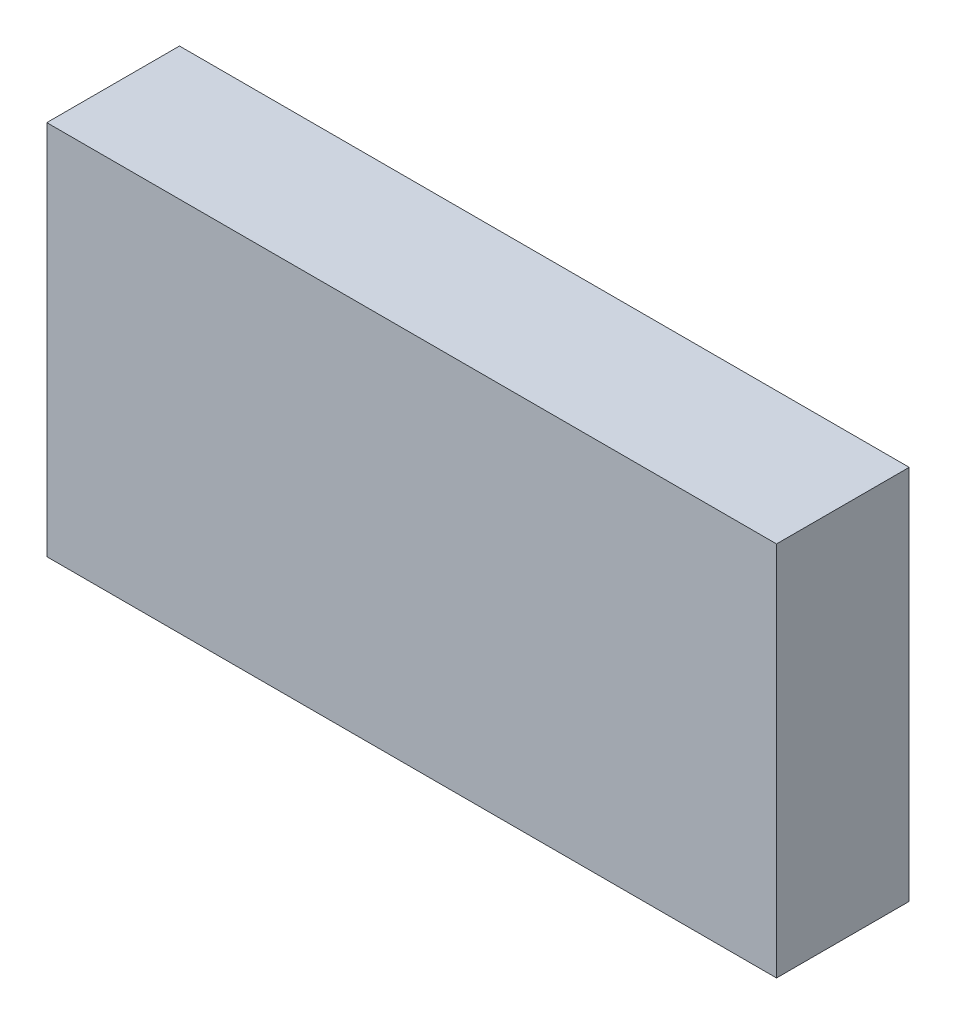
ISO-10303-21;
HEADER;
FILE_DESCRIPTION(('STEP AP214'),'2;1');
FILE_NAME('part.step','',(''),(''),'','','');
FILE_SCHEMA(('AUTOMOTIVE_DESIGN { 1 0 10303 214 1 1 1 1 }'));
ENDSEC;
DATA;
#1=APPLICATION_CONTEXT('core data for automotive mechanical design processes');
#2=APPLICATION_PROTOCOL_DEFINITION('international standard','automotive_design',2000,#1);
#3=PRODUCT_CONTEXT('',#1,'mechanical');
#4=PRODUCT('Part','Part','',(#3));
#5=PRODUCT_RELATED_PRODUCT_CATEGORY('part','',(#4));
#6=PRODUCT_DEFINITION_FORMATION('','',#4);
#7=PRODUCT_DEFINITION_CONTEXT('part definition',#1,'design');
#8=PRODUCT_DEFINITION('design','',#6,#7);
#9=PRODUCT_DEFINITION_SHAPE('','',#8);
#10=(LENGTH_UNIT() NAMED_UNIT(*) SI_UNIT(.MILLI.,.METRE.));
#11=(NAMED_UNIT(*) PLANE_ANGLE_UNIT() SI_UNIT($,.RADIAN.));
#12=(NAMED_UNIT(*) SI_UNIT($,.STERADIAN.) SOLID_ANGLE_UNIT());
#13=UNCERTAINTY_MEASURE_WITH_UNIT(LENGTH_MEASURE(1.E-05),#10,'distance_accuracy_value','');
#14=(GEOMETRIC_REPRESENTATION_CONTEXT(3) GLOBAL_UNCERTAINTY_ASSIGNED_CONTEXT((#13)) GLOBAL_UNIT_ASSIGNED_CONTEXT((#10,
#11,#12)) REPRESENTATION_CONTEXT('',''));
#15=CARTESIAN_POINT('',(0.,0.,0.));
#16=DIRECTION('',(0.,0.,1.));
#17=DIRECTION('',(1.,0.,0.));
#18=AXIS2_PLACEMENT_3D('',#15,#16,#17);
#19=CARTESIAN_POINT('',(3.02500000000001,0.85,0.625));
#20=DIRECTION('',(0.,-1.,0.));
#21=DIRECTION('',(1.,0.,0.));
#22=AXIS2_PLACEMENT_3D('',#19,#20,#21);
#23=PLANE('',#22);
#24=DIRECTION('',(-1.,0.,0.));
#25=VECTOR('',#24,1.);
#26=CARTESIAN_POINT('',(3.02500000000001,0.85,0.025));
#27=LINE('',#26,#25);
#28=CARTESIAN_POINT('',(3.02500000000001,0.85,0.025));
#29=VERTEX_POINT('',#28);
#30=CARTESIAN_POINT('',(-0.274999999999989,0.85,0.025));
#31=VERTEX_POINT('',#30);
#32=EDGE_CURVE('E75',#29,#31,#27,.T.);
#33=ORIENTED_EDGE('',*,*,#32,.T.);
#34=DIRECTION('',(0.,0.,-1.));
#35=VECTOR('',#34,1.);
#36=CARTESIAN_POINT('',(-0.274999999999989,0.85,0.625));
#37=LINE('',#36,#35);
#38=CARTESIAN_POINT('',(-0.274999999999989,0.85,0.625));
#39=VERTEX_POINT('',#38);
#40=EDGE_CURVE('E11',#39,#31,#37,.T.);
#41=ORIENTED_EDGE('',*,*,#40,.F.);
#42=DIRECTION('',(-1.,0.,0.));
#43=VECTOR('',#42,1.);
#44=CARTESIAN_POINT('',(3.02500000000001,0.85,0.625));
#45=LINE('',#44,#43);
#46=CARTESIAN_POINT('',(3.02500000000001,0.85,0.625));
#47=VERTEX_POINT('',#46);
#48=EDGE_CURVE('E93',#47,#39,#45,.T.);
#49=ORIENTED_EDGE('',*,*,#48,.F.);
#50=DIRECTION('',(0.,0.,-1.));
#51=VECTOR('',#50,1.);
#52=CARTESIAN_POINT('',(3.02500000000001,0.85,0.625));
#53=LINE('',#52,#51);
#54=EDGE_CURVE('E87',#47,#29,#53,.T.);
#55=ORIENTED_EDGE('',*,*,#54,.T.);
#56=EDGE_LOOP('',(#33,#41,#49,#55));
#57=FACE_BOUND('',#56,.T.);
#58=ADVANCED_FACE('F31',(#57),#23,.F.);
#59=CARTESIAN_POINT('',(-0.274999999999989,0.85,0.625));
#60=DIRECTION('',(1.,0.,0.));
#61=DIRECTION('',(0.,0.,-1.));
#62=AXIS2_PLACEMENT_3D('',#59,#60,#61);
#63=PLANE('',#62);
#64=DIRECTION('',(0.,-1.,0.));
#65=VECTOR('',#64,1.);
#66=CARTESIAN_POINT('',(-0.274999999999989,0.85,0.025));
#67=LINE('',#66,#65);
#68=CARTESIAN_POINT('',(-0.274999999999989,-0.85,0.025));
#69=VERTEX_POINT('',#68);
#70=EDGE_CURVE('E71',#31,#69,#67,.T.);
#71=ORIENTED_EDGE('',*,*,#70,.T.);
#72=DIRECTION('',(0.,0.,-1.));
#73=VECTOR('',#72,1.);
#74=CARTESIAN_POINT('',(-0.274999999999989,-0.85,0.625));
#75=LINE('',#74,#73);
#76=CARTESIAN_POINT('',(-0.274999999999989,-0.85,0.625));
#77=VERTEX_POINT('',#76);
#78=EDGE_CURVE('E38',#77,#69,#75,.T.);
#79=ORIENTED_EDGE('',*,*,#78,.F.);
#80=DIRECTION('',(0.,-1.,0.));
#81=VECTOR('',#80,1.);
#82=CARTESIAN_POINT('',(-0.274999999999989,0.85,0.625));
#83=LINE('',#82,#81);
#84=EDGE_CURVE('E83',#39,#77,#83,.T.);
#85=ORIENTED_EDGE('',*,*,#84,.F.);
#86=ORIENTED_EDGE('',*,*,#40,.T.);
#87=EDGE_LOOP('',(#71,#79,#85,#86));
#88=FACE_BOUND('',#87,.T.);
#89=ADVANCED_FACE('F82',(#88),#63,.F.);
#90=CARTESIAN_POINT('',(-0.274999999999989,-0.85,0.625));
#91=DIRECTION('',(0.,1.,0.));
#92=DIRECTION('',(0.,0.,1.));
#93=AXIS2_PLACEMENT_3D('',#90,#91,#92);
#94=PLANE('',#93);
#95=DIRECTION('',(1.,0.,0.));
#96=VECTOR('',#95,1.);
#97=CARTESIAN_POINT('',(-0.274999999999989,-0.85,0.025));
#98=LINE('',#97,#96);
#99=CARTESIAN_POINT('',(3.025,-0.85,0.025));
#100=VERTEX_POINT('',#99);
#101=EDGE_CURVE('E76',#69,#100,#98,.T.);
#102=ORIENTED_EDGE('',*,*,#101,.T.);
#103=DIRECTION('',(0.,0.,-1.));
#104=VECTOR('',#103,1.);
#105=CARTESIAN_POINT('',(3.025,-0.85,0.625));
#106=LINE('',#105,#104);
#107=CARTESIAN_POINT('',(3.025,-0.85,0.625));
#108=VERTEX_POINT('',#107);
#109=EDGE_CURVE('E99',#108,#100,#106,.T.);
#110=ORIENTED_EDGE('',*,*,#109,.F.);
#111=DIRECTION('',(1.,0.,0.));
#112=VECTOR('',#111,1.);
#113=CARTESIAN_POINT('',(-0.274999999999989,-0.85,0.625));
#114=LINE('',#113,#112);
#115=EDGE_CURVE('E50',#77,#108,#114,.T.);
#116=ORIENTED_EDGE('',*,*,#115,.F.);
#117=ORIENTED_EDGE('',*,*,#78,.T.);
#118=EDGE_LOOP('',(#102,#110,#116,#117));
#119=FACE_BOUND('',#118,.T.);
#120=ADVANCED_FACE('F102',(#119),#94,.F.);
#121=CARTESIAN_POINT('',(3.02500000000001,0.85,0.625));
#122=DIRECTION('',(-1.,0.,0.));
#123=DIRECTION('',(0.,-1.,0.));
#124=AXIS2_PLACEMENT_3D('',#121,#122,#123);
#125=PLANE('',#124);
#126=DIRECTION('',(0.,1.,0.));
#127=VECTOR('',#126,1.);
#128=CARTESIAN_POINT('',(3.02500000000001,0.85,0.025));
#129=LINE('',#128,#127);
#130=EDGE_CURVE('E91',#100,#29,#129,.T.);
#131=ORIENTED_EDGE('',*,*,#130,.T.);
#132=ORIENTED_EDGE('',*,*,#54,.F.);
#133=DIRECTION('',(0.,1.,0.));
#134=VECTOR('',#133,1.);
#135=CARTESIAN_POINT('',(3.02500000000001,0.85,0.625));
#136=LINE('',#135,#134);
#137=EDGE_CURVE('E45',#108,#47,#136,.T.);
#138=ORIENTED_EDGE('',*,*,#137,.F.);
#139=ORIENTED_EDGE('',*,*,#109,.T.);
#140=EDGE_LOOP('',(#131,#132,#138,#139));
#141=FACE_BOUND('',#140,.T.);
#142=ADVANCED_FACE('F104',(#141),#125,.F.);
#143=CARTESIAN_POINT('',(-0.274999999999989,0.85,0.625));
#144=DIRECTION('',(0.,0.,1.));
#145=DIRECTION('',(1.,0.,0.));
#146=AXIS2_PLACEMENT_3D('',#143,#144,#145);
#147=PLANE('',#146);
#148=ORIENTED_EDGE('',*,*,#48,.T.);
#149=ORIENTED_EDGE('',*,*,#84,.T.);
#150=ORIENTED_EDGE('',*,*,#115,.T.);
#151=ORIENTED_EDGE('',*,*,#137,.T.);
#152=EDGE_LOOP('',(#148,#149,#150,#151));
#153=FACE_BOUND('',#152,.T.);
#154=ADVANCED_FACE('F105',(#153),#147,.T.);
#155=CARTESIAN_POINT('',(-0.274999999999989,0.85,0.025));
#156=DIRECTION('',(0.,0.,1.));
#157=DIRECTION('',(1.,0.,0.));
#158=AXIS2_PLACEMENT_3D('',#155,#156,#157);
#159=PLANE('',#158);
#160=ORIENTED_EDGE('',*,*,#32,.F.);
#161=ORIENTED_EDGE('',*,*,#130,.F.);
#162=ORIENTED_EDGE('',*,*,#101,.F.);
#163=ORIENTED_EDGE('',*,*,#70,.F.);
#164=EDGE_LOOP('',(#160,#161,#162,#163));
#165=FACE_BOUND('',#164,.T.);
#166=ADVANCED_FACE('F72',(#165),#159,.F.);
#167=CLOSED_SHELL('',(#58,#89,#120,#142,#154,#166));
#168=MANIFOLD_SOLID_BREP('B2',#167);
#169=ADVANCED_BREP_SHAPE_REPRESENTATION('',(#18,#168),#14);
#170=SHAPE_DEFINITION_REPRESENTATION(#9,#169);
ENDSEC;
END-ISO-10303-21;
